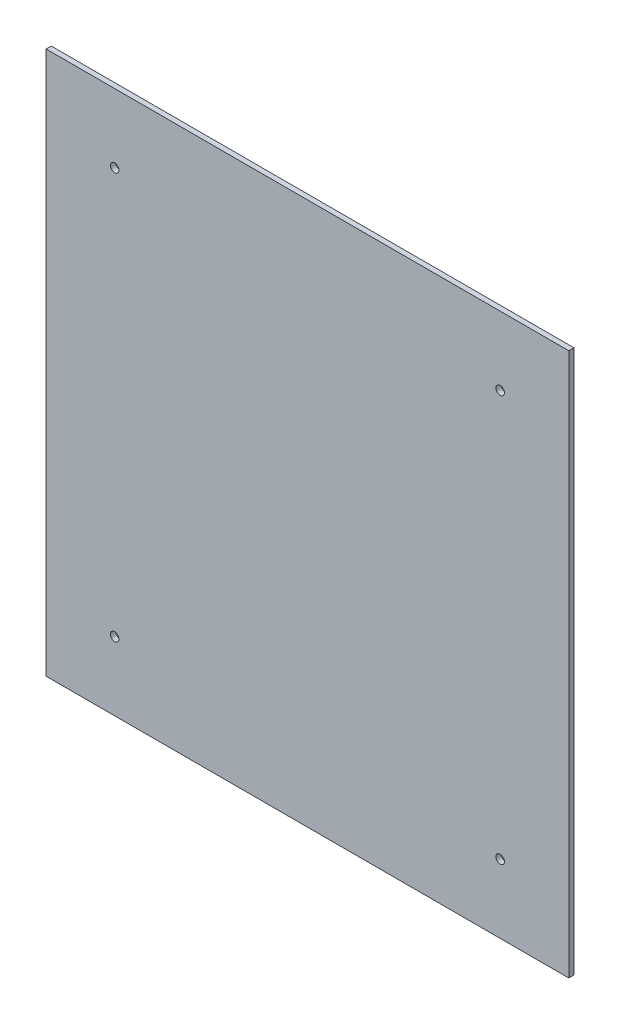
ISO-10303-21;
HEADER;
FILE_DESCRIPTION(('STEP AP214'),'2;1');
FILE_NAME('part.step','',(''),(''),'','','');
FILE_SCHEMA(('AUTOMOTIVE_DESIGN { 1 0 10303 214 1 1 1 1 }'));
ENDSEC;
DATA;
#1=APPLICATION_CONTEXT('core data for automotive mechanical design processes');
#2=APPLICATION_PROTOCOL_DEFINITION('international standard','automotive_design',2000,#1);
#3=PRODUCT_CONTEXT('',#1,'mechanical');
#4=PRODUCT('Part','Part','',(#3));
#5=PRODUCT_RELATED_PRODUCT_CATEGORY('part','',(#4));
#6=PRODUCT_DEFINITION_FORMATION('','',#4);
#7=PRODUCT_DEFINITION_CONTEXT('part definition',#1,'design');
#8=PRODUCT_DEFINITION('design','',#6,#7);
#9=PRODUCT_DEFINITION_SHAPE('','',#8);
#10=(LENGTH_UNIT() NAMED_UNIT(*) SI_UNIT(.MILLI.,.METRE.));
#11=(NAMED_UNIT(*) PLANE_ANGLE_UNIT() SI_UNIT($,.RADIAN.));
#12=(NAMED_UNIT(*) SI_UNIT($,.STERADIAN.) SOLID_ANGLE_UNIT());
#13=UNCERTAINTY_MEASURE_WITH_UNIT(LENGTH_MEASURE(1.E-05),#10,'distance_accuracy_value','');
#14=(GEOMETRIC_REPRESENTATION_CONTEXT(3) GLOBAL_UNCERTAINTY_ASSIGNED_CONTEXT((#13)) GLOBAL_UNIT_ASSIGNED_CONTEXT((#10,
#11,#12)) REPRESENTATION_CONTEXT('',''));
#15=CARTESIAN_POINT('',(0.,0.,0.));
#16=DIRECTION('',(0.,0.,1.));
#17=DIRECTION('',(1.,0.,0.));
#18=AXIS2_PLACEMENT_3D('',#15,#16,#17);
#19=CARTESIAN_POINT('',(-152.4,-158.399999999999,3.));
#20=DIRECTION('',(1.,0.,0.));
#21=DIRECTION('',(0.,0.,-1.));
#22=AXIS2_PLACEMENT_3D('',#19,#20,#21);
#23=PLANE('',#22);
#24=DIRECTION('',(0.,-1.,0.));
#25=VECTOR('',#24,1.);
#26=CARTESIAN_POINT('',(-152.4,-158.399999999999,0.));
#27=LINE('',#26,#25);
#28=CARTESIAN_POINT('',(-152.4,158.400000000001,0.));
#29=VERTEX_POINT('',#28);
#30=CARTESIAN_POINT('',(-152.4,-158.399999999999,0.));
#31=VERTEX_POINT('',#30);
#32=EDGE_CURVE('E96',#29,#31,#27,.T.);
#33=ORIENTED_EDGE('',*,*,#32,.T.);
#34=DIRECTION('',(0.,0.,-1.));
#35=VECTOR('',#34,1.);
#36=CARTESIAN_POINT('',(-152.4,-158.399999999999,3.));
#37=LINE('',#36,#35);
#38=CARTESIAN_POINT('',(-152.4,-158.399999999999,3.));
#39=VERTEX_POINT('',#38);
#40=EDGE_CURVE('E11',#39,#31,#37,.T.);
#41=ORIENTED_EDGE('',*,*,#40,.F.);
#42=DIRECTION('',(0.,-1.,0.));
#43=VECTOR('',#42,1.);
#44=CARTESIAN_POINT('',(-152.4,-158.399999999999,3.));
#45=LINE('',#44,#43);
#46=CARTESIAN_POINT('',(-152.4,158.400000000001,3.));
#47=VERTEX_POINT('',#46);
#48=EDGE_CURVE('E84',#47,#39,#45,.T.);
#49=ORIENTED_EDGE('',*,*,#48,.F.);
#50=DIRECTION('',(0.,0.,-1.));
#51=VECTOR('',#50,1.);
#52=CARTESIAN_POINT('',(-152.4,158.400000000001,3.));
#53=LINE('',#52,#51);
#54=EDGE_CURVE('E92',#47,#29,#53,.T.);
#55=ORIENTED_EDGE('',*,*,#54,.T.);
#56=EDGE_LOOP('',(#33,#41,#49,#55));
#57=FACE_BOUND('',#56,.T.);
#58=ADVANCED_FACE('F33',(#57),#23,.F.);
#59=CARTESIAN_POINT('',(152.399999999999,-158.399999999999,3.));
#60=DIRECTION('',(0.,1.,0.));
#61=DIRECTION('',(-1.,0.,0.));
#62=AXIS2_PLACEMENT_3D('',#59,#60,#61);
#63=PLANE('',#62);
#64=DIRECTION('',(1.,0.,0.));
#65=VECTOR('',#64,1.);
#66=CARTESIAN_POINT('',(152.399999999999,-158.399999999999,0.));
#67=LINE('',#66,#65);
#68=CARTESIAN_POINT('',(152.399999999999,-158.399999999999,0.));
#69=VERTEX_POINT('',#68);
#70=EDGE_CURVE('E88',#31,#69,#67,.T.);
#71=ORIENTED_EDGE('',*,*,#70,.T.);
#72=DIRECTION('',(0.,0.,-1.));
#73=VECTOR('',#72,1.);
#74=CARTESIAN_POINT('',(152.399999999999,-158.399999999999,3.));
#75=LINE('',#74,#73);
#76=CARTESIAN_POINT('',(152.399999999999,-158.399999999999,3.));
#77=VERTEX_POINT('',#76);
#78=EDGE_CURVE('E41',#77,#69,#75,.T.);
#79=ORIENTED_EDGE('',*,*,#78,.F.);
#80=DIRECTION('',(1.,0.,0.));
#81=VECTOR('',#80,1.);
#82=CARTESIAN_POINT('',(152.399999999999,-158.399999999999,3.));
#83=LINE('',#82,#81);
#84=EDGE_CURVE('E79',#39,#77,#83,.T.);
#85=ORIENTED_EDGE('',*,*,#84,.F.);
#86=ORIENTED_EDGE('',*,*,#40,.T.);
#87=EDGE_LOOP('',(#71,#79,#85,#86));
#88=FACE_BOUND('',#87,.T.);
#89=ADVANCED_FACE('F87',(#88),#63,.F.);
#90=CARTESIAN_POINT('',(152.399999999999,-158.399999999999,3.));
#91=DIRECTION('',(-1.,0.,0.));
#92=DIRECTION('',(0.,-1.,0.));
#93=AXIS2_PLACEMENT_3D('',#90,#91,#92);
#94=PLANE('',#93);
#95=DIRECTION('',(0.,1.,0.));
#96=VECTOR('',#95,1.);
#97=CARTESIAN_POINT('',(152.399999999999,-158.399999999999,0.));
#98=LINE('',#97,#96);
#99=CARTESIAN_POINT('',(152.4,158.400000000001,0.));
#100=VERTEX_POINT('',#99);
#101=EDGE_CURVE('E66',#69,#100,#98,.T.);
#102=ORIENTED_EDGE('',*,*,#101,.T.);
#103=DIRECTION('',(0.,0.,-1.));
#104=VECTOR('',#103,1.);
#105=CARTESIAN_POINT('',(152.4,158.400000000001,3.));
#106=LINE('',#105,#104);
#107=CARTESIAN_POINT('',(152.4,158.400000000001,3.));
#108=VERTEX_POINT('',#107);
#109=EDGE_CURVE('E89',#108,#100,#106,.T.);
#110=ORIENTED_EDGE('',*,*,#109,.F.);
#111=DIRECTION('',(0.,1.,0.));
#112=VECTOR('',#111,1.);
#113=CARTESIAN_POINT('',(152.399999999999,-158.399999999999,3.));
#114=LINE('',#113,#112);
#115=EDGE_CURVE('E82',#77,#108,#114,.T.);
#116=ORIENTED_EDGE('',*,*,#115,.F.);
#117=ORIENTED_EDGE('',*,*,#78,.T.);
#118=EDGE_LOOP('',(#102,#110,#116,#117));
#119=FACE_BOUND('',#118,.T.);
#120=ADVANCED_FACE('F90',(#119),#94,.F.);
#121=CARTESIAN_POINT('',(152.4,158.400000000001,3.));
#122=DIRECTION('',(0.,-1.,0.));
#123=DIRECTION('',(1.,0.,0.));
#124=AXIS2_PLACEMENT_3D('',#121,#122,#123);
#125=PLANE('',#124);
#126=DIRECTION('',(-1.,0.,0.));
#127=VECTOR('',#126,1.);
#128=CARTESIAN_POINT('',(152.4,158.400000000001,0.));
#129=LINE('',#128,#127);
#130=EDGE_CURVE('E72',#100,#29,#129,.T.);
#131=ORIENTED_EDGE('',*,*,#130,.T.);
#132=ORIENTED_EDGE('',*,*,#54,.F.);
#133=DIRECTION('',(-1.,0.,0.));
#134=VECTOR('',#133,1.);
#135=CARTESIAN_POINT('',(152.4,158.400000000001,3.));
#136=LINE('',#135,#134);
#137=EDGE_CURVE('E49',#108,#47,#136,.T.);
#138=ORIENTED_EDGE('',*,*,#137,.F.);
#139=ORIENTED_EDGE('',*,*,#109,.T.);
#140=EDGE_LOOP('',(#131,#132,#138,#139));
#141=FACE_BOUND('',#140,.T.);
#142=ADVANCED_FACE('F104',(#141),#125,.F.);
#143=CARTESIAN_POINT('',(0.,0.,3.));
#144=DIRECTION('',(0.,0.,1.));
#145=DIRECTION('',(1.,0.,0.));
#146=AXIS2_PLACEMENT_3D('',#143,#144,#145);
#147=PLANE('',#146);
#148=CARTESIAN_POINT('',(-112.4,-118.399999999999,3.));
#149=DIRECTION('',(0.,0.,-1.));
#150=DIRECTION('',(-1.,0.,0.));
#151=AXIS2_PLACEMENT_3D('',#148,#149,#150);
#152=CIRCLE('',#151,2.5);
#153=CARTESIAN_POINT('',(-114.9,-118.399999999999,3.));
#154=VERTEX_POINT('',#153);
#155=EDGE_CURVE('E113',#154,#154,#152,.T.);
#156=ORIENTED_EDGE('',*,*,#155,.T.);
#157=EDGE_LOOP('',(#156));
#158=FACE_BOUND('',#157,.T.);
#159=CARTESIAN_POINT('',(112.399999999999,-118.399999999999,3.));
#160=DIRECTION('',(0.,0.,-1.));
#161=DIRECTION('',(-1.,0.,0.));
#162=AXIS2_PLACEMENT_3D('',#159,#160,#161);
#163=CIRCLE('',#162,2.5);
#164=CARTESIAN_POINT('',(109.899999999999,-118.399999999999,3.));
#165=VERTEX_POINT('',#164);
#166=EDGE_CURVE('E125',#165,#165,#163,.T.);
#167=ORIENTED_EDGE('',*,*,#166,.T.);
#168=EDGE_LOOP('',(#167));
#169=FACE_BOUND('',#168,.T.);
#170=CARTESIAN_POINT('',(112.399999999999,118.400000000001,3.));
#171=DIRECTION('',(0.,0.,-1.));
#172=DIRECTION('',(-1.,0.,0.));
#173=AXIS2_PLACEMENT_3D('',#170,#171,#172);
#174=CIRCLE('',#173,2.5);
#175=CARTESIAN_POINT('',(109.899999999999,118.400000000001,3.));
#176=VERTEX_POINT('',#175);
#177=EDGE_CURVE('E119',#176,#176,#174,.T.);
#178=ORIENTED_EDGE('',*,*,#177,.T.);
#179=EDGE_LOOP('',(#178));
#180=FACE_BOUND('',#179,.T.);
#181=CARTESIAN_POINT('',(-112.4,118.400000000001,3.));
#182=DIRECTION('',(0.,0.,-1.));
#183=DIRECTION('',(-1.,0.,0.));
#184=AXIS2_PLACEMENT_3D('',#181,#182,#183);
#185=CIRCLE('',#184,2.5);
#186=CARTESIAN_POINT('',(-114.9,118.400000000001,3.));
#187=VERTEX_POINT('',#186);
#188=EDGE_CURVE('E99',#187,#187,#185,.T.);
#189=ORIENTED_EDGE('',*,*,#188,.T.);
#190=EDGE_LOOP('',(#189));
#191=FACE_BOUND('',#190,.T.);
#192=ORIENTED_EDGE('',*,*,#48,.T.);
#193=ORIENTED_EDGE('',*,*,#84,.T.);
#194=ORIENTED_EDGE('',*,*,#115,.T.);
#195=ORIENTED_EDGE('',*,*,#137,.T.);
#196=EDGE_LOOP('',(#192,#193,#194,#195));
#197=FACE_BOUND('',#196,.T.);
#198=ADVANCED_FACE('F80',(#158,#169,#180,#191,#197),#147,.T.);
#199=CARTESIAN_POINT('',(0.,0.,0.));
#200=DIRECTION('',(0.,0.,1.));
#201=DIRECTION('',(1.,0.,0.));
#202=AXIS2_PLACEMENT_3D('',#199,#200,#201);
#203=PLANE('',#202);
#204=CARTESIAN_POINT('',(-112.4,-118.399999999999,0.));
#205=DIRECTION('',(0.,0.,-1.));
#206=DIRECTION('',(-1.,0.,0.));
#207=AXIS2_PLACEMENT_3D('',#204,#205,#206);
#208=CIRCLE('',#207,2.5);
#209=CARTESIAN_POINT('',(-114.9,-118.399999999999,0.));
#210=VERTEX_POINT('',#209);
#211=EDGE_CURVE('E128',#210,#210,#208,.T.);
#212=ORIENTED_EDGE('',*,*,#211,.F.);
#213=EDGE_LOOP('',(#212));
#214=FACE_BOUND('',#213,.T.);
#215=CARTESIAN_POINT('',(112.399999999999,-118.399999999999,0.));
#216=DIRECTION('',(0.,0.,-1.));
#217=DIRECTION('',(-1.,0.,0.));
#218=AXIS2_PLACEMENT_3D('',#215,#216,#217);
#219=CIRCLE('',#218,2.5);
#220=CARTESIAN_POINT('',(109.899999999999,-118.399999999999,0.));
#221=VERTEX_POINT('',#220);
#222=EDGE_CURVE('E122',#221,#221,#219,.T.);
#223=ORIENTED_EDGE('',*,*,#222,.F.);
#224=EDGE_LOOP('',(#223));
#225=FACE_BOUND('',#224,.T.);
#226=CARTESIAN_POINT('',(112.399999999999,118.400000000001,0.));
#227=DIRECTION('',(0.,0.,-1.));
#228=DIRECTION('',(-1.,0.,0.));
#229=AXIS2_PLACEMENT_3D('',#226,#227,#228);
#230=CIRCLE('',#229,2.5);
#231=CARTESIAN_POINT('',(109.899999999999,118.400000000001,0.));
#232=VERTEX_POINT('',#231);
#233=EDGE_CURVE('E116',#232,#232,#230,.T.);
#234=ORIENTED_EDGE('',*,*,#233,.F.);
#235=EDGE_LOOP('',(#234));
#236=FACE_BOUND('',#235,.T.);
#237=CARTESIAN_POINT('',(-112.4,118.400000000001,0.));
#238=DIRECTION('',(0.,0.,-1.));
#239=DIRECTION('',(-1.,0.,0.));
#240=AXIS2_PLACEMENT_3D('',#237,#238,#239);
#241=CIRCLE('',#240,2.5);
#242=CARTESIAN_POINT('',(-114.9,118.400000000001,0.));
#243=VERTEX_POINT('',#242);
#244=EDGE_CURVE('E110',#243,#243,#241,.T.);
#245=ORIENTED_EDGE('',*,*,#244,.F.);
#246=EDGE_LOOP('',(#245));
#247=FACE_BOUND('',#246,.T.);
#248=ORIENTED_EDGE('',*,*,#32,.F.);
#249=ORIENTED_EDGE('',*,*,#130,.F.);
#250=ORIENTED_EDGE('',*,*,#101,.F.);
#251=ORIENTED_EDGE('',*,*,#70,.F.);
#252=EDGE_LOOP('',(#248,#249,#250,#251));
#253=FACE_BOUND('',#252,.T.);
#254=ADVANCED_FACE('F107',(#214,#225,#236,#247,#253),#203,.F.);
#255=CARTESIAN_POINT('',(-112.4,118.400000000001,3.));
#256=DIRECTION('',(0.,0.,-1.));
#257=DIRECTION('',(-1.,0.,0.));
#258=AXIS2_PLACEMENT_3D('',#255,#256,#257);
#259=CYLINDRICAL_SURFACE('',#258,2.5);
#260=ORIENTED_EDGE('',*,*,#188,.F.);
#261=EDGE_LOOP('',(#260));
#262=FACE_BOUND('',#261,.T.);
#263=ORIENTED_EDGE('',*,*,#244,.T.);
#264=EDGE_LOOP('',(#263));
#265=FACE_BOUND('',#264,.T.);
#266=ADVANCED_FACE('F145',(#262,#265),#259,.F.);
#267=CARTESIAN_POINT('',(112.399999999999,118.400000000001,3.));
#268=DIRECTION('',(0.,0.,-1.));
#269=DIRECTION('',(-1.,0.,0.));
#270=AXIS2_PLACEMENT_3D('',#267,#268,#269);
#271=CYLINDRICAL_SURFACE('',#270,2.5);
#272=ORIENTED_EDGE('',*,*,#177,.F.);
#273=EDGE_LOOP('',(#272));
#274=FACE_BOUND('',#273,.T.);
#275=ORIENTED_EDGE('',*,*,#233,.T.);
#276=EDGE_LOOP('',(#275));
#277=FACE_BOUND('',#276,.T.);
#278=ADVANCED_FACE('F154',(#274,#277),#271,.F.);
#279=CARTESIAN_POINT('',(112.399999999999,-118.399999999999,3.));
#280=DIRECTION('',(0.,0.,-1.));
#281=DIRECTION('',(-1.,0.,0.));
#282=AXIS2_PLACEMENT_3D('',#279,#280,#281);
#283=CYLINDRICAL_SURFACE('',#282,2.5);
#284=ORIENTED_EDGE('',*,*,#166,.F.);
#285=EDGE_LOOP('',(#284));
#286=FACE_BOUND('',#285,.T.);
#287=ORIENTED_EDGE('',*,*,#222,.T.);
#288=EDGE_LOOP('',(#287));
#289=FACE_BOUND('',#288,.T.);
#290=ADVANCED_FACE('F139',(#286,#289),#283,.F.);
#291=CARTESIAN_POINT('',(-112.4,-118.399999999999,3.));
#292=DIRECTION('',(0.,0.,-1.));
#293=DIRECTION('',(-1.,0.,0.));
#294=AXIS2_PLACEMENT_3D('',#291,#292,#293);
#295=CYLINDRICAL_SURFACE('',#294,2.5);
#296=ORIENTED_EDGE('',*,*,#155,.F.);
#297=EDGE_LOOP('',(#296));
#298=FACE_BOUND('',#297,.T.);
#299=ORIENTED_EDGE('',*,*,#211,.T.);
#300=EDGE_LOOP('',(#299));
#301=FACE_BOUND('',#300,.T.);
#302=ADVANCED_FACE('F136',(#298,#301),#295,.F.);
#303=CLOSED_SHELL('',(#58,#89,#120,#142,#198,#254,#266,#278,#290,#302));
#304=MANIFOLD_SOLID_BREP('B2',#303);
#305=ADVANCED_BREP_SHAPE_REPRESENTATION('',(#18,#304),#14);
#306=SHAPE_DEFINITION_REPRESENTATION(#9,#305);
ENDSEC;
END-ISO-10303-21;
